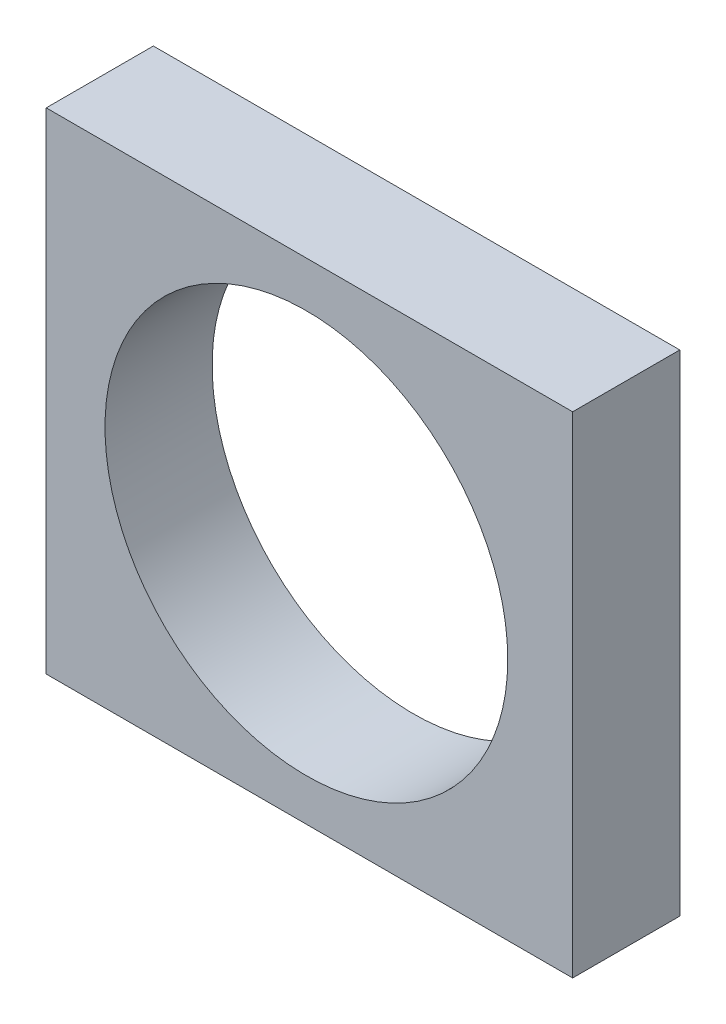
ISO-10303-21;
HEADER;
FILE_DESCRIPTION(('STEP AP214'),'2;1');
FILE_NAME('part.step','',(''),(''),'','','');
FILE_SCHEMA(('AUTOMOTIVE_DESIGN { 1 0 10303 214 1 1 1 1 }'));
ENDSEC;
DATA;
#1=APPLICATION_CONTEXT('core data for automotive mechanical design processes');
#2=APPLICATION_PROTOCOL_DEFINITION('international standard','automotive_design',2000,#1);
#3=PRODUCT_CONTEXT('',#1,'mechanical');
#4=PRODUCT('Part','Part','',(#3));
#5=PRODUCT_RELATED_PRODUCT_CATEGORY('part','',(#4));
#6=PRODUCT_DEFINITION_FORMATION('','',#4);
#7=PRODUCT_DEFINITION_CONTEXT('part definition',#1,'design');
#8=PRODUCT_DEFINITION('design','',#6,#7);
#9=PRODUCT_DEFINITION_SHAPE('','',#8);
#10=(LENGTH_UNIT() NAMED_UNIT(*) SI_UNIT(.MILLI.,.METRE.));
#11=(NAMED_UNIT(*) PLANE_ANGLE_UNIT() SI_UNIT($,.RADIAN.));
#12=(NAMED_UNIT(*) SI_UNIT($,.STERADIAN.) SOLID_ANGLE_UNIT());
#13=UNCERTAINTY_MEASURE_WITH_UNIT(LENGTH_MEASURE(1.E-05),#10,'distance_accuracy_value','');
#14=(GEOMETRIC_REPRESENTATION_CONTEXT(3) GLOBAL_UNCERTAINTY_ASSIGNED_CONTEXT((#13)) GLOBAL_UNIT_ASSIGNED_CONTEXT((#10,
#11,#12)) REPRESENTATION_CONTEXT('',''));
#15=CARTESIAN_POINT('',(0.,0.,0.));
#16=DIRECTION('',(0.,0.,1.));
#17=DIRECTION('',(1.,0.,0.));
#18=AXIS2_PLACEMENT_3D('',#15,#16,#17);
#19=CARTESIAN_POINT('',(0.,0.,5.));
#20=DIRECTION('',(0.,0.,1.));
#21=DIRECTION('',(1.,0.,0.));
#22=AXIS2_PLACEMENT_3D('',#19,#20,#21);
#23=PLANE('',#22);
#24=DIRECTION('',(0.,-1.,0.));
#25=VECTOR('',#24,1.);
#26=CARTESIAN_POINT('',(-12.1435044664769,11.529141062138,5.));
#27=LINE('',#26,#25);
#28=CARTESIAN_POINT('',(-12.1435044664769,11.529141062138,5.));
#29=VERTEX_POINT('',#28);
#30=CARTESIAN_POINT('',(-12.1435044664769,-11.3608324334937,5.));
#31=VERTEX_POINT('',#30);
#32=EDGE_CURVE('E87',#29,#31,#27,.T.);
#33=ORIENTED_EDGE('',*,*,#32,.T.);
#34=DIRECTION('',(1.,0.,0.));
#35=VECTOR('',#34,1.);
#36=CARTESIAN_POINT('',(-12.1435044664769,-11.3608324334937,5.));
#37=LINE('',#36,#35);
#38=CARTESIAN_POINT('',(12.4295553155983,-11.3608324334937,5.));
#39=VERTEX_POINT('',#38);
#40=EDGE_CURVE('E82',#31,#39,#37,.T.);
#41=ORIENTED_EDGE('',*,*,#40,.T.);
#42=DIRECTION('',(0.,1.,0.));
#43=VECTOR('',#42,1.);
#44=CARTESIAN_POINT('',(12.4295553155983,11.529141062138,5.));
#45=LINE('',#44,#43);
#46=CARTESIAN_POINT('',(12.4295553155983,11.529141062138,5.));
#47=VERTEX_POINT('',#46);
#48=EDGE_CURVE('E85',#39,#47,#45,.T.);
#49=ORIENTED_EDGE('',*,*,#48,.T.);
#50=DIRECTION('',(-1.,0.,0.));
#51=VECTOR('',#50,1.);
#52=CARTESIAN_POINT('',(-12.1435044664769,11.529141062138,5.));
#53=LINE('',#52,#51);
#54=EDGE_CURVE('E52',#47,#29,#53,.T.);
#55=ORIENTED_EDGE('',*,*,#54,.T.);
#56=EDGE_LOOP('',(#33,#41,#49,#55));
#57=FACE_BOUND('',#56,.T.);
#58=CARTESIAN_POINT('',(0.,0.,5.));
#59=DIRECTION('',(0.,0.,1.));
#60=DIRECTION('',(1.,0.,0.));
#61=AXIS2_PLACEMENT_3D('',#58,#59,#60);
#62=CIRCLE('',#61,9.4);
#63=CARTESIAN_POINT('',(9.4,0.,5.));
#64=VERTEX_POINT('',#63);
#65=EDGE_CURVE('E102',#64,#64,#62,.T.);
#66=ORIENTED_EDGE('',*,*,#65,.F.);
#67=EDGE_LOOP('',(#66));
#68=FACE_BOUND('',#67,.T.);
#69=ADVANCED_FACE('F35',(#57,#68),#23,.T.);
#70=CARTESIAN_POINT('',(0.,0.,0.));
#71=DIRECTION('',(0.,0.,1.));
#72=DIRECTION('',(1.,0.,0.));
#73=AXIS2_PLACEMENT_3D('',#70,#71,#72);
#74=PLANE('',#73);
#75=DIRECTION('',(0.,-1.,0.));
#76=VECTOR('',#75,1.);
#77=CARTESIAN_POINT('',(-12.1435044664769,11.529141062138,0.));
#78=LINE('',#77,#76);
#79=CARTESIAN_POINT('',(-12.1435044664769,11.529141062138,0.));
#80=VERTEX_POINT('',#79);
#81=CARTESIAN_POINT('',(-12.1435044664769,-11.3608324334937,0.));
#82=VERTEX_POINT('',#81);
#83=EDGE_CURVE('E99',#80,#82,#78,.T.);
#84=ORIENTED_EDGE('',*,*,#83,.F.);
#85=DIRECTION('',(-1.,0.,0.));
#86=VECTOR('',#85,1.);
#87=CARTESIAN_POINT('',(-12.1435044664769,11.529141062138,0.));
#88=LINE('',#87,#86);
#89=CARTESIAN_POINT('',(12.4295553155983,11.529141062138,0.));
#90=VERTEX_POINT('',#89);
#91=EDGE_CURVE('E75',#90,#80,#88,.T.);
#92=ORIENTED_EDGE('',*,*,#91,.F.);
#93=DIRECTION('',(0.,1.,0.));
#94=VECTOR('',#93,1.);
#95=CARTESIAN_POINT('',(12.4295553155983,11.529141062138,0.));
#96=LINE('',#95,#94);
#97=CARTESIAN_POINT('',(12.4295553155983,-11.3608324334937,0.));
#98=VERTEX_POINT('',#97);
#99=EDGE_CURVE('E69',#98,#90,#96,.T.);
#100=ORIENTED_EDGE('',*,*,#99,.F.);
#101=DIRECTION('',(1.,0.,0.));
#102=VECTOR('',#101,1.);
#103=CARTESIAN_POINT('',(-12.1435044664769,-11.3608324334937,0.));
#104=LINE('',#103,#102);
#105=EDGE_CURVE('E91',#82,#98,#104,.T.);
#106=ORIENTED_EDGE('',*,*,#105,.F.);
#107=EDGE_LOOP('',(#84,#92,#100,#106));
#108=FACE_BOUND('',#107,.T.);
#109=CARTESIAN_POINT('',(0.,0.,0.));
#110=DIRECTION('',(0.,0.,1.));
#111=DIRECTION('',(1.,0.,0.));
#112=AXIS2_PLACEMENT_3D('',#109,#110,#111);
#113=CIRCLE('',#112,9.4);
#114=CARTESIAN_POINT('',(9.4,0.,0.));
#115=VERTEX_POINT('',#114);
#116=EDGE_CURVE('E114',#115,#115,#113,.T.);
#117=ORIENTED_EDGE('',*,*,#116,.T.);
#118=EDGE_LOOP('',(#117));
#119=FACE_BOUND('',#118,.T.);
#120=ADVANCED_FACE('F110',(#108,#119),#74,.F.);
#121=CARTESIAN_POINT('',(-12.1435044664769,11.529141062138,5.));
#122=DIRECTION('',(1.,0.,0.));
#123=DIRECTION('',(0.,0.,-1.));
#124=AXIS2_PLACEMENT_3D('',#121,#122,#123);
#125=PLANE('',#124);
#126=ORIENTED_EDGE('',*,*,#83,.T.);
#127=DIRECTION('',(0.,0.,-1.));
#128=VECTOR('',#127,1.);
#129=CARTESIAN_POINT('',(-12.1435044664769,-11.3608324334937,5.));
#130=LINE('',#129,#128);
#131=EDGE_CURVE('E11',#31,#82,#130,.T.);
#132=ORIENTED_EDGE('',*,*,#131,.F.);
#133=ORIENTED_EDGE('',*,*,#32,.F.);
#134=DIRECTION('',(0.,0.,-1.));
#135=VECTOR('',#134,1.);
#136=CARTESIAN_POINT('',(-12.1435044664769,11.529141062138,5.));
#137=LINE('',#136,#135);
#138=EDGE_CURVE('E95',#29,#80,#137,.T.);
#139=ORIENTED_EDGE('',*,*,#138,.T.);
#140=EDGE_LOOP('',(#126,#132,#133,#139));
#141=FACE_BOUND('',#140,.T.);
#142=ADVANCED_FACE('F37',(#141),#125,.F.);
#143=CARTESIAN_POINT('',(-12.1435044664769,-11.3608324334937,5.));
#144=DIRECTION('',(0.,1.,0.));
#145=DIRECTION('',(0.,0.,1.));
#146=AXIS2_PLACEMENT_3D('',#143,#144,#145);
#147=PLANE('',#146);
#148=ORIENTED_EDGE('',*,*,#105,.T.);
#149=DIRECTION('',(0.,0.,-1.));
#150=VECTOR('',#149,1.);
#151=CARTESIAN_POINT('',(12.4295553155983,-11.3608324334937,5.));
#152=LINE('',#151,#150);
#153=EDGE_CURVE('E44',#39,#98,#152,.T.);
#154=ORIENTED_EDGE('',*,*,#153,.F.);
#155=ORIENTED_EDGE('',*,*,#40,.F.);
#156=ORIENTED_EDGE('',*,*,#131,.T.);
#157=EDGE_LOOP('',(#148,#154,#155,#156));
#158=FACE_BOUND('',#157,.T.);
#159=ADVANCED_FACE('F90',(#158),#147,.F.);
#160=CARTESIAN_POINT('',(12.4295553155983,11.529141062138,5.));
#161=DIRECTION('',(-1.,0.,0.));
#162=DIRECTION('',(0.,0.,1.));
#163=AXIS2_PLACEMENT_3D('',#160,#161,#162);
#164=PLANE('',#163);
#165=ORIENTED_EDGE('',*,*,#99,.T.);
#166=DIRECTION('',(0.,0.,-1.));
#167=VECTOR('',#166,1.);
#168=CARTESIAN_POINT('',(12.4295553155983,11.529141062138,5.));
#169=LINE('',#168,#167);
#170=EDGE_CURVE('E92',#47,#90,#169,.T.);
#171=ORIENTED_EDGE('',*,*,#170,.F.);
#172=ORIENTED_EDGE('',*,*,#48,.F.);
#173=ORIENTED_EDGE('',*,*,#153,.T.);
#174=EDGE_LOOP('',(#165,#171,#172,#173));
#175=FACE_BOUND('',#174,.T.);
#176=ADVANCED_FACE('F93',(#175),#164,.F.);
#177=CARTESIAN_POINT('',(-12.1435044664769,11.529141062138,5.));
#178=DIRECTION('',(0.,-1.,0.));
#179=DIRECTION('',(0.,0.,-1.));
#180=AXIS2_PLACEMENT_3D('',#177,#178,#179);
#181=PLANE('',#180);
#182=ORIENTED_EDGE('',*,*,#91,.T.);
#183=ORIENTED_EDGE('',*,*,#138,.F.);
#184=ORIENTED_EDGE('',*,*,#54,.F.);
#185=ORIENTED_EDGE('',*,*,#170,.T.);
#186=EDGE_LOOP('',(#182,#183,#184,#185));
#187=FACE_BOUND('',#186,.T.);
#188=ADVANCED_FACE('F107',(#187),#181,.F.);
#189=CARTESIAN_POINT('',(0.,0.,5.));
#190=DIRECTION('',(0.,0.,-1.));
#191=DIRECTION('',(-1.,0.,0.));
#192=AXIS2_PLACEMENT_3D('',#189,#190,#191);
#193=CYLINDRICAL_SURFACE('',#192,9.4);
#194=ORIENTED_EDGE('',*,*,#65,.T.);
#195=EDGE_LOOP('',(#194));
#196=FACE_BOUND('',#195,.T.);
#197=ORIENTED_EDGE('',*,*,#116,.F.);
#198=EDGE_LOOP('',(#197));
#199=FACE_BOUND('',#198,.T.);
#200=ADVANCED_FACE('F120',(#196,#199),#193,.F.);
#201=CLOSED_SHELL('',(#69,#120,#142,#159,#176,#188,#200));
#202=MANIFOLD_SOLID_BREP('B2',#201);
#203=ADVANCED_BREP_SHAPE_REPRESENTATION('',(#18,#202),#14);
#204=SHAPE_DEFINITION_REPRESENTATION(#9,#203);
ENDSEC;
END-ISO-10303-21;
